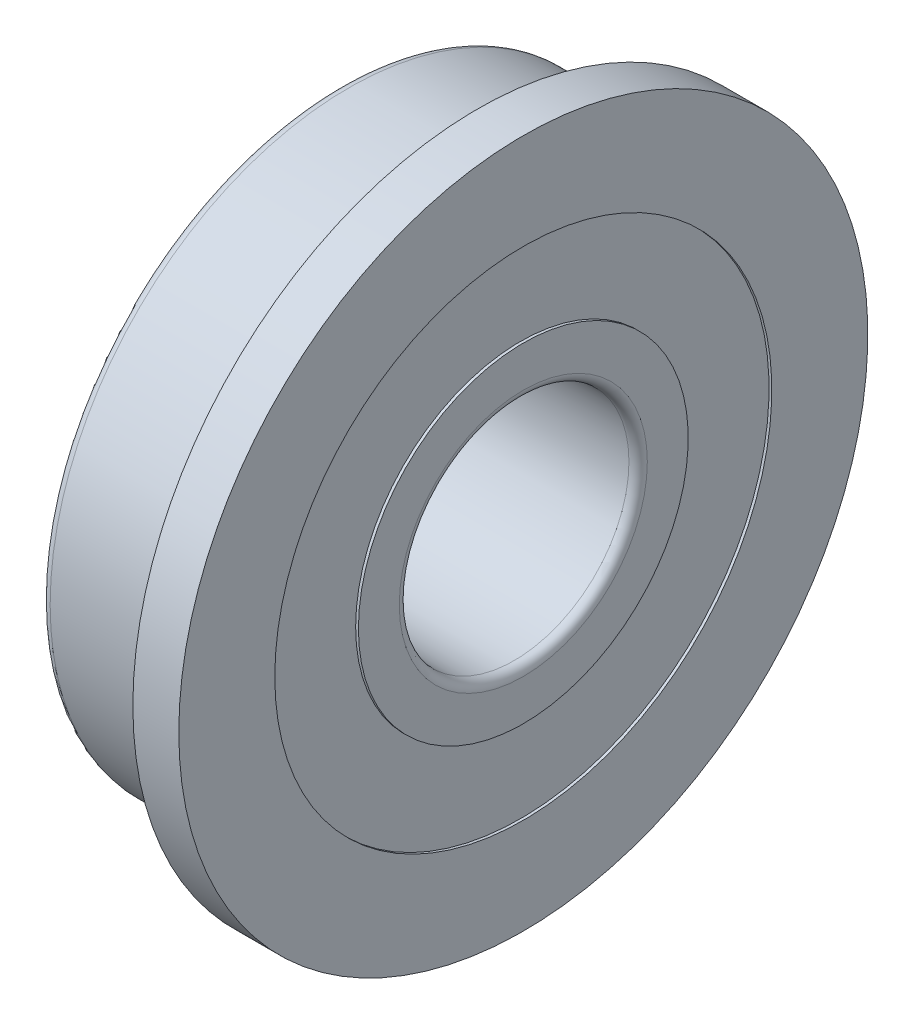
ISO-10303-21;
HEADER;
FILE_DESCRIPTION(('STEP AP214'),'2;1');
FILE_NAME('part.step','',(''),(''),'','','');
FILE_SCHEMA(('AUTOMOTIVE_DESIGN { 1 0 10303 214 1 1 1 1 }'));
ENDSEC;
DATA;
#1=APPLICATION_CONTEXT('core data for automotive mechanical design processes');
#2=APPLICATION_PROTOCOL_DEFINITION('international standard','automotive_design',2000,#1);
#3=PRODUCT_CONTEXT('',#1,'mechanical');
#4=PRODUCT('Part','Part','',(#3));
#5=PRODUCT_RELATED_PRODUCT_CATEGORY('part','',(#4));
#6=PRODUCT_DEFINITION_FORMATION('','',#4);
#7=PRODUCT_DEFINITION_CONTEXT('part definition',#1,'design');
#8=PRODUCT_DEFINITION('design','',#6,#7);
#9=PRODUCT_DEFINITION_SHAPE('','',#8);
#10=(LENGTH_UNIT() NAMED_UNIT(*) SI_UNIT(.MILLI.,.METRE.));
#11=(NAMED_UNIT(*) PLANE_ANGLE_UNIT() SI_UNIT($,.RADIAN.));
#12=(NAMED_UNIT(*) SI_UNIT($,.STERADIAN.) SOLID_ANGLE_UNIT());
#13=UNCERTAINTY_MEASURE_WITH_UNIT(LENGTH_MEASURE(1.E-05),#10,'distance_accuracy_value','');
#14=(GEOMETRIC_REPRESENTATION_CONTEXT(3) GLOBAL_UNCERTAINTY_ASSIGNED_CONTEXT((#13)) GLOBAL_UNIT_ASSIGNED_CONTEXT((#10,
#11,#12)) REPRESENTATION_CONTEXT('',''));
#15=CARTESIAN_POINT('',(0.,0.,0.));
#16=DIRECTION('',(0.,0.,1.));
#17=DIRECTION('',(1.,0.,0.));
#18=AXIS2_PLACEMENT_3D('',#15,#16,#17);
#19=CARTESIAN_POINT('',(0.,0.,0.));
#20=DIRECTION('',(-1.,0.,0.));
#21=DIRECTION('',(0.,0.,1.));
#22=AXIS2_PLACEMENT_3D('',#19,#20,#21);
#23=CYLINDRICAL_SURFACE('',#22,3.59);
#24=CARTESIAN_POINT('',(0.3,0.,0.));
#25=DIRECTION('',(-1.,0.,0.));
#26=DIRECTION('',(0.,0.,1.));
#27=AXIS2_PLACEMENT_3D('',#24,#25,#26);
#28=CIRCLE('',#27,3.59);
#29=CARTESIAN_POINT('',(0.3,0.,3.59));
#30=VERTEX_POINT('',#29);
#31=EDGE_CURVE('E11',#30,#30,#28,.T.);
#32=ORIENTED_EDGE('',*,*,#31,.F.);
#33=EDGE_LOOP('',(#32));
#34=FACE_BOUND('',#33,.T.);
#35=CARTESIAN_POINT('',(0.0600000000000002,0.,0.));
#36=DIRECTION('',(-1.,0.,0.));
#37=DIRECTION('',(0.,0.,1.));
#38=AXIS2_PLACEMENT_3D('',#35,#36,#37);
#39=CIRCLE('',#38,3.59);
#40=CARTESIAN_POINT('',(0.0600000000000002,0.,3.59));
#41=VERTEX_POINT('',#40);
#42=EDGE_CURVE('E53',#41,#41,#39,.T.);
#43=ORIENTED_EDGE('',*,*,#42,.T.);
#44=EDGE_LOOP('',(#43));
#45=FACE_BOUND('',#44,.T.);
#46=ADVANCED_FACE('F39',(#34,#45),#23,.F.);
#47=CARTESIAN_POINT('',(0.3,3.59,0.));
#48=DIRECTION('',(-1.,0.,0.));
#49=DIRECTION('',(0.,0.,1.));
#50=AXIS2_PLACEMENT_3D('',#47,#48,#49);
#51=PLANE('',#50);
#52=CARTESIAN_POINT('',(0.3,0.,0.));
#53=DIRECTION('',(-1.,0.,0.));
#54=DIRECTION('',(0.,0.,1.));
#55=AXIS2_PLACEMENT_3D('',#52,#53,#54);
#56=CIRCLE('',#55,5.41);
#57=CARTESIAN_POINT('',(0.3,0.,5.41));
#58=VERTEX_POINT('',#57);
#59=EDGE_CURVE('E45',#58,#58,#56,.T.);
#60=ORIENTED_EDGE('',*,*,#59,.F.);
#61=EDGE_LOOP('',(#60));
#62=FACE_BOUND('',#61,.T.);
#63=ORIENTED_EDGE('',*,*,#31,.T.);
#64=EDGE_LOOP('',(#63));
#65=FACE_BOUND('',#64,.T.);
#66=ADVANCED_FACE('F68',(#62,#65),#51,.F.);
#67=CARTESIAN_POINT('',(0.,0.,0.));
#68=DIRECTION('',(-1.,0.,0.));
#69=DIRECTION('',(0.,0.,1.));
#70=AXIS2_PLACEMENT_3D('',#67,#68,#69);
#71=CYLINDRICAL_SURFACE('',#70,5.41);
#72=CARTESIAN_POINT('',(0.0600000000000002,0.,0.));
#73=DIRECTION('',(-1.,0.,0.));
#74=DIRECTION('',(0.,0.,1.));
#75=AXIS2_PLACEMENT_3D('',#72,#73,#74);
#76=CIRCLE('',#75,5.41);
#77=CARTESIAN_POINT('',(0.0600000000000002,0.,5.41));
#78=VERTEX_POINT('',#77);
#79=EDGE_CURVE('E49',#78,#78,#76,.T.);
#80=ORIENTED_EDGE('',*,*,#79,.F.);
#81=EDGE_LOOP('',(#80));
#82=FACE_BOUND('',#81,.T.);
#83=ORIENTED_EDGE('',*,*,#59,.T.);
#84=EDGE_LOOP('',(#83));
#85=FACE_BOUND('',#84,.T.);
#86=ADVANCED_FACE('F63',(#82,#85),#71,.T.);
#87=CARTESIAN_POINT('',(0.0600000000000002,5.41,0.));
#88=DIRECTION('',(1.,0.,0.));
#89=DIRECTION('',(0.,0.,-1.));
#90=AXIS2_PLACEMENT_3D('',#87,#88,#89);
#91=PLANE('',#90);
#92=ORIENTED_EDGE('',*,*,#42,.F.);
#93=EDGE_LOOP('',(#92));
#94=FACE_BOUND('',#93,.T.);
#95=ORIENTED_EDGE('',*,*,#79,.T.);
#96=EDGE_LOOP('',(#95));
#97=FACE_BOUND('',#96,.T.);
#98=ADVANCED_FACE('F60',(#94,#97),#91,.F.);
#99=CLOSED_SHELL('',(#46,#66,#86,#98));
#100=MANIFOLD_SOLID_BREP('B2',#99);
#101=CARTESIAN_POINT('',(3.7,3.59,0.));
#102=DIRECTION('',(1.,0.,0.));
#103=DIRECTION('',(0.,0.,-1.));
#104=AXIS2_PLACEMENT_3D('',#101,#102,#103);
#105=PLANE('',#104);
#106=CARTESIAN_POINT('',(3.7,0.,0.));
#107=DIRECTION('',(-1.,0.,0.));
#108=DIRECTION('',(0.,0.,1.));
#109=AXIS2_PLACEMENT_3D('',#106,#107,#108);
#110=CIRCLE('',#109,3.59);
#111=CARTESIAN_POINT('',(3.7,0.,3.59));
#112=VERTEX_POINT('',#111);
#113=EDGE_CURVE('E120',#112,#112,#110,.T.);
#114=ORIENTED_EDGE('',*,*,#113,.F.);
#115=EDGE_LOOP('',(#114));
#116=FACE_BOUND('',#115,.T.);
#117=CARTESIAN_POINT('',(3.7,0.,0.));
#118=DIRECTION('',(-1.,0.,0.));
#119=DIRECTION('',(0.,0.,1.));
#120=AXIS2_PLACEMENT_3D('',#117,#118,#119);
#121=CIRCLE('',#120,5.41);
#122=CARTESIAN_POINT('',(3.7,0.,5.41));
#123=VERTEX_POINT('',#122);
#124=EDGE_CURVE('E38',#123,#123,#121,.T.);
#125=ORIENTED_EDGE('',*,*,#124,.T.);
#126=EDGE_LOOP('',(#125));
#127=FACE_BOUND('',#126,.T.);
#128=ADVANCED_FACE('F106',(#116,#127),#105,.F.);
#129=CARTESIAN_POINT('',(0.,0.,0.));
#130=DIRECTION('',(-1.,0.,0.));
#131=DIRECTION('',(0.,0.,1.));
#132=AXIS2_PLACEMENT_3D('',#129,#130,#131);
#133=CYLINDRICAL_SURFACE('',#132,5.41);
#134=ORIENTED_EDGE('',*,*,#124,.F.);
#135=EDGE_LOOP('',(#134));
#136=FACE_BOUND('',#135,.T.);
#137=CARTESIAN_POINT('',(3.94,0.,0.));
#138=DIRECTION('',(-1.,0.,0.));
#139=DIRECTION('',(0.,0.,1.));
#140=AXIS2_PLACEMENT_3D('',#137,#138,#139);
#141=CIRCLE('',#140,5.41);
#142=CARTESIAN_POINT('',(3.94,0.,5.41));
#143=VERTEX_POINT('',#142);
#144=EDGE_CURVE('E112',#143,#143,#141,.T.);
#145=ORIENTED_EDGE('',*,*,#144,.T.);
#146=EDGE_LOOP('',(#145));
#147=FACE_BOUND('',#146,.T.);
#148=ADVANCED_FACE('F129',(#136,#147),#133,.T.);
#149=CARTESIAN_POINT('',(3.94,5.41,0.));
#150=DIRECTION('',(-1.,0.,0.));
#151=DIRECTION('',(0.,0.,1.));
#152=AXIS2_PLACEMENT_3D('',#149,#150,#151);
#153=PLANE('',#152);
#154=ORIENTED_EDGE('',*,*,#144,.F.);
#155=EDGE_LOOP('',(#154));
#156=FACE_BOUND('',#155,.T.);
#157=CARTESIAN_POINT('',(3.94,0.,0.));
#158=DIRECTION('',(-1.,0.,0.));
#159=DIRECTION('',(0.,0.,1.));
#160=AXIS2_PLACEMENT_3D('',#157,#158,#159);
#161=CIRCLE('',#160,3.59);
#162=CARTESIAN_POINT('',(3.94,0.,3.59));
#163=VERTEX_POINT('',#162);
#164=EDGE_CURVE('E116',#163,#163,#161,.T.);
#165=ORIENTED_EDGE('',*,*,#164,.T.);
#166=EDGE_LOOP('',(#165));
#167=FACE_BOUND('',#166,.T.);
#168=ADVANCED_FACE('F133',(#156,#167),#153,.F.);
#169=CARTESIAN_POINT('',(0.,0.,0.));
#170=DIRECTION('',(-1.,0.,0.));
#171=DIRECTION('',(0.,0.,1.));
#172=AXIS2_PLACEMENT_3D('',#169,#170,#171);
#173=CYLINDRICAL_SURFACE('',#172,3.59);
#174=ORIENTED_EDGE('',*,*,#164,.F.);
#175=EDGE_LOOP('',(#174));
#176=FACE_BOUND('',#175,.T.);
#177=ORIENTED_EDGE('',*,*,#113,.T.);
#178=EDGE_LOOP('',(#177));
#179=FACE_BOUND('',#178,.T.);
#180=ADVANCED_FACE('F126',(#176,#179),#173,.F.);
#181=CLOSED_SHELL('',(#128,#148,#168,#180));
#182=MANIFOLD_SOLID_BREP('B6',#181);
#183=CARTESIAN_POINT('',(2.,3.78564089774035,2.43288367855014));
#184=DIRECTION('',(-1.,0.,0.));
#185=DIRECTION('',(0.,0.841253532831188,0.540640817455586));
#186=AXIS2_PLACEMENT_3D('',#183,#184,#185);
#187=SPHERICAL_SURFACE('',#186,1.);
#188=CARTESIAN_POINT('',(1.,3.78564089774035,2.43288367855014));
#189=VERTEX_POINT('',#188);
#190=VERTEX_LOOP('',#189);
#191=FACE_BOUND('',#190,.T.);
#192=ADVANCED_FACE('F173',(#191),#187,.T.);
#193=CLOSED_SHELL('',(#192));
#194=MANIFOLD_SOLID_BREP('B33',#193);
#195=CARTESIAN_POINT('',(2.,1.86936755850854,4.09334397909531));
#196=DIRECTION('',(-1.,0.,0.));
#197=DIRECTION('',(0.,0.415415013001897,0.909631995354513));
#198=AXIS2_PLACEMENT_3D('',#195,#196,#197);
#199=SPHERICAL_SURFACE('',#198,1.);
#200=CARTESIAN_POINT('',(1.,1.86936755850854,4.09334397909531));
#201=VERTEX_POINT('',#200);
#202=VERTEX_LOOP('',#201);
#203=FACE_BOUND('',#202,.T.);
#204=ADVANCED_FACE('F191',(#203),#199,.T.);
#205=CLOSED_SHELL('',(#204));
#206=MANIFOLD_SOLID_BREP('B102',#205);
#207=CARTESIAN_POINT('',(2.,-0.640416772229736,4.4541964884642));
#208=DIRECTION('',(-1.,0.,0.));
#209=DIRECTION('',(0.,-0.142314838273275,0.989821441880934));
#210=AXIS2_PLACEMENT_3D('',#207,#208,#209);
#211=SPHERICAL_SURFACE('',#210,1.);
#212=CARTESIAN_POINT('',(1.,-0.640416772229736,4.4541964884642));
#213=VERTEX_POINT('',#212);
#214=VERTEX_LOOP('',#213);
#215=FACE_BOUND('',#214,.T.);
#216=ADVANCED_FACE('F209',(#215),#211,.T.);
#217=CLOSED_SHELL('',(#216));
#218=MANIFOLD_SOLID_BREP('B169',#217);
#219=CARTESIAN_POINT('',(2.,-2.94687330275375,3.40087308459419));
#220=DIRECTION('',(-1.,0.,0.));
#221=DIRECTION('',(0.,-0.654860733945278,0.755749574354264));
#222=AXIS2_PLACEMENT_3D('',#219,#220,#221);
#223=SPHERICAL_SURFACE('',#222,1.);
#224=CARTESIAN_POINT('',(1.,-2.94687330275375,3.40087308459419));
#225=VERTEX_POINT('',#224);
#226=VERTEX_LOOP('',#225);
#227=FACE_BOUND('',#226,.T.);
#228=ADVANCED_FACE('F227',(#227),#223,.T.);
#229=CLOSED_SHELL('',(#228));
#230=MANIFOLD_SOLID_BREP('B187',#229);
#231=CARTESIAN_POINT('',(2.,-4.31771838126523,1.26779650578647));
#232=DIRECTION('',(-1.,0.,0.));
#233=DIRECTION('',(0.,-0.959492973614495,0.281732556841437));
#234=AXIS2_PLACEMENT_3D('',#231,#232,#233);
#235=SPHERICAL_SURFACE('',#234,1.);
#236=CARTESIAN_POINT('',(1.,-4.31771838126523,1.26779650578647));
#237=VERTEX_POINT('',#236);
#238=VERTEX_LOOP('',#237);
#239=FACE_BOUND('',#238,.T.);
#240=ADVANCED_FACE('F245',(#239),#235,.T.);
#241=CLOSED_SHELL('',(#240));
#242=MANIFOLD_SOLID_BREP('B205',#241);
#243=CARTESIAN_POINT('',(2.,-4.31771838126525,-1.2677965057864));
#244=DIRECTION('',(-1.,0.,0.));
#245=DIRECTION('',(0.,-0.959492973614499,-0.281732556841423));
#246=AXIS2_PLACEMENT_3D('',#243,#244,#245);
#247=SPHERICAL_SURFACE('',#246,1.);
#248=CARTESIAN_POINT('',(1.,-4.31771838126525,-1.2677965057864));
#249=VERTEX_POINT('',#248);
#250=VERTEX_LOOP('',#249);
#251=FACE_BOUND('',#250,.T.);
#252=ADVANCED_FACE('F263',(#251),#247,.T.);
#253=CLOSED_SHELL('',(#252));
#254=MANIFOLD_SOLID_BREP('B223',#253);
#255=CARTESIAN_POINT('',(2.,-2.9468733027538,-3.40087308459415));
#256=DIRECTION('',(-1.,0.,0.));
#257=DIRECTION('',(0.,-0.654860733945289,-0.755749574354255));
#258=AXIS2_PLACEMENT_3D('',#255,#256,#257);
#259=SPHERICAL_SURFACE('',#258,1.);
#260=CARTESIAN_POINT('',(1.,-2.9468733027538,-3.40087308459415));
#261=VERTEX_POINT('',#260);
#262=VERTEX_LOOP('',#261);
#263=FACE_BOUND('',#262,.T.);
#264=ADVANCED_FACE('F281',(#263),#259,.T.);
#265=CLOSED_SHELL('',(#264));
#266=MANIFOLD_SOLID_BREP('B241',#265);
#267=CARTESIAN_POINT('',(2.,-0.6404167722298,-4.45419648846419));
#268=DIRECTION('',(-1.,0.,0.));
#269=DIRECTION('',(0.,-0.142314838273289,-0.989821441880932));
#270=AXIS2_PLACEMENT_3D('',#267,#268,#269);
#271=SPHERICAL_SURFACE('',#270,1.);
#272=CARTESIAN_POINT('',(1.,-0.6404167722298,-4.45419648846419));
#273=VERTEX_POINT('',#272);
#274=VERTEX_LOOP('',#273);
#275=FACE_BOUND('',#274,.T.);
#276=ADVANCED_FACE('F299',(#275),#271,.T.);
#277=CLOSED_SHELL('',(#276));
#278=MANIFOLD_SOLID_BREP('B259',#277);
#279=CARTESIAN_POINT('',(2.,1.86936755850848,-4.09334397909534));
#280=DIRECTION('',(-1.,0.,0.));
#281=DIRECTION('',(0.,0.415415013001884,-0.909631995354519));
#282=AXIS2_PLACEMENT_3D('',#279,#280,#281);
#283=SPHERICAL_SURFACE('',#282,1.);
#284=CARTESIAN_POINT('',(1.,1.86936755850848,-4.09334397909534));
#285=VERTEX_POINT('',#284);
#286=VERTEX_LOOP('',#285);
#287=FACE_BOUND('',#286,.T.);
#288=ADVANCED_FACE('F317',(#287),#283,.T.);
#289=CLOSED_SHELL('',(#288));
#290=MANIFOLD_SOLID_BREP('B277',#289);
#291=CARTESIAN_POINT('',(2.,3.78564089774031,-2.43288367855019));
#292=DIRECTION('',(-1.,0.,0.));
#293=DIRECTION('',(0.,0.841253532831181,-0.540640817455599));
#294=AXIS2_PLACEMENT_3D('',#291,#292,#293);
#295=SPHERICAL_SURFACE('',#294,1.);
#296=CARTESIAN_POINT('',(1.,3.78564089774031,-2.43288367855019));
#297=VERTEX_POINT('',#296);
#298=VERTEX_LOOP('',#297);
#299=FACE_BOUND('',#298,.T.);
#300=ADVANCED_FACE('F335',(#299),#295,.T.);
#301=CLOSED_SHELL('',(#300));
#302=MANIFOLD_SOLID_BREP('B295',#301);
#303=CARTESIAN_POINT('',(2.,4.5,0.));
#304=DIRECTION('',(-1.,0.,0.));
#305=DIRECTION('',(0.,1.,0.));
#306=AXIS2_PLACEMENT_3D('',#303,#304,#305);
#307=SPHERICAL_SURFACE('',#306,1.);
#308=CARTESIAN_POINT('',(1.,4.5,0.));
#309=VERTEX_POINT('',#308);
#310=VERTEX_LOOP('',#309);
#311=FACE_BOUND('',#310,.T.);
#312=ADVANCED_FACE('F355',(#311),#307,.T.);
#313=CLOSED_SHELL('',(#312));
#314=MANIFOLD_SOLID_BREP('B313',#313);
#315=CARTESIAN_POINT('',(0.,0.,0.));
#316=DIRECTION('',(1.,0.,0.));
#317=DIRECTION('',(0.,0.,-1.));
#318=AXIS2_PLACEMENT_3D('',#315,#316,#317);
#319=CYLINDRICAL_SURFACE('',#318,3.8);
#320=CARTESIAN_POINT('',(1.28585715714571,0.,0.));
#321=DIRECTION('',(1.,0.,0.));
#322=DIRECTION('',(0.,0.,-1.));
#323=AXIS2_PLACEMENT_3D('',#320,#321,#322);
#324=CIRCLE('',#323,3.8);
#325=CARTESIAN_POINT('',(1.28585715714571,0.,-3.8));
#326=VERTEX_POINT('',#325);
#327=EDGE_CURVE('E391',#326,#326,#324,.T.);
#328=ORIENTED_EDGE('',*,*,#327,.F.);
#329=EDGE_LOOP('',(#328));
#330=FACE_BOUND('',#329,.T.);
#331=CARTESIAN_POINT('',(0.3,0.,0.));
#332=DIRECTION('',(-1.,0.,0.));
#333=DIRECTION('',(0.,0.,1.));
#334=AXIS2_PLACEMENT_3D('',#331,#332,#333);
#335=CIRCLE('',#334,3.8);
#336=CARTESIAN_POINT('',(0.3,0.,3.8));
#337=VERTEX_POINT('',#336);
#338=EDGE_CURVE('E378',#337,#337,#335,.T.);
#339=ORIENTED_EDGE('',*,*,#338,.F.);
#340=EDGE_LOOP('',(#339));
#341=FACE_BOUND('',#340,.T.);
#342=ADVANCED_FACE('F374',(#330,#341),#319,.T.);
#343=CARTESIAN_POINT('',(0.,6.3,0.));
#344=DIRECTION('',(1.,0.,0.));
#345=DIRECTION('',(0.,0.,-1.));
#346=AXIS2_PLACEMENT_3D('',#343,#344,#345);
#347=PLANE('',#346);
#348=CARTESIAN_POINT('',(0.,0.,0.));
#349=DIRECTION('',(-1.,0.,0.));
#350=DIRECTION('',(0.,0.,1.));
#351=AXIS2_PLACEMENT_3D('',#348,#349,#350);
#352=CIRCLE('',#351,2.7);
#353=CARTESIAN_POINT('',(0.,0.,2.7));
#354=VERTEX_POINT('',#353);
#355=EDGE_CURVE('E397',#354,#354,#352,.T.);
#356=ORIENTED_EDGE('',*,*,#355,.F.);
#357=EDGE_LOOP('',(#356));
#358=FACE_BOUND('',#357,.T.);
#359=CARTESIAN_POINT('',(0.,0.,0.));
#360=DIRECTION('',(-1.,0.,0.));
#361=DIRECTION('',(0.,0.,1.));
#362=AXIS2_PLACEMENT_3D('',#359,#360,#361);
#363=CIRCLE('',#362,3.59);
#364=CARTESIAN_POINT('',(0.,0.,3.59));
#365=VERTEX_POINT('',#364);
#366=EDGE_CURVE('E430',#365,#365,#363,.T.);
#367=ORIENTED_EDGE('',*,*,#366,.T.);
#368=EDGE_LOOP('',(#367));
#369=FACE_BOUND('',#368,.T.);
#370=ADVANCED_FACE('F424',(#358,#369),#347,.F.);
#371=CARTESIAN_POINT('',(0.,0.,0.));
#372=DIRECTION('',(1.,0.,0.));
#373=DIRECTION('',(0.,0.,-1.));
#374=AXIS2_PLACEMENT_3D('',#371,#372,#373);
#375=CYLINDRICAL_SURFACE('',#374,3.8);
#376=CARTESIAN_POINT('',(2.71414284285429,0.,0.));
#377=DIRECTION('',(1.,0.,0.));
#378=DIRECTION('',(0.,0.,-1.));
#379=AXIS2_PLACEMENT_3D('',#376,#377,#378);
#380=CIRCLE('',#379,3.8);
#381=CARTESIAN_POINT('',(2.71414284285429,0.,-3.8));
#382=VERTEX_POINT('',#381);
#383=EDGE_CURVE('E394',#382,#382,#380,.T.);
#384=ORIENTED_EDGE('',*,*,#383,.T.);
#385=EDGE_LOOP('',(#384));
#386=FACE_BOUND('',#385,.T.);
#387=CARTESIAN_POINT('',(3.7,0.,0.));
#388=DIRECTION('',(1.,0.,0.));
#389=DIRECTION('',(0.,0.,-1.));
#390=AXIS2_PLACEMENT_3D('',#387,#388,#389);
#391=CIRCLE('',#390,3.8);
#392=CARTESIAN_POINT('',(3.7,0.,-3.8));
#393=VERTEX_POINT('',#392);
#394=EDGE_CURVE('E395',#393,#393,#391,.T.);
#395=ORIENTED_EDGE('',*,*,#394,.F.);
#396=EDGE_LOOP('',(#395));
#397=FACE_BOUND('',#396,.T.);
#398=ADVANCED_FACE('F427',(#386,#397),#375,.T.);
#399=CARTESIAN_POINT('',(4.,7.5,0.));
#400=DIRECTION('',(-1.,0.,0.));
#401=DIRECTION('',(0.,0.,1.));
#402=AXIS2_PLACEMENT_3D('',#399,#400,#401);
#403=PLANE('',#402);
#404=CARTESIAN_POINT('',(4.,0.,0.));
#405=DIRECTION('',(-1.,0.,0.));
#406=DIRECTION('',(0.,0.,1.));
#407=AXIS2_PLACEMENT_3D('',#404,#405,#406);
#408=CIRCLE('',#407,2.7);
#409=CARTESIAN_POINT('',(4.,0.,2.7));
#410=VERTEX_POINT('',#409);
#411=EDGE_CURVE('E354',#410,#410,#408,.T.);
#412=ORIENTED_EDGE('',*,*,#411,.T.);
#413=EDGE_LOOP('',(#412));
#414=FACE_BOUND('',#413,.T.);
#415=CARTESIAN_POINT('',(4.,0.,0.));
#416=DIRECTION('',(-1.,0.,0.));
#417=DIRECTION('',(0.,0.,1.));
#418=AXIS2_PLACEMENT_3D('',#415,#416,#417);
#419=CIRCLE('',#418,3.59);
#420=CARTESIAN_POINT('',(4.,0.,3.59));
#421=VERTEX_POINT('',#420);
#422=EDGE_CURVE('E403',#421,#421,#419,.T.);
#423=ORIENTED_EDGE('',*,*,#422,.F.);
#424=EDGE_LOOP('',(#423));
#425=FACE_BOUND('',#424,.T.);
#426=ADVANCED_FACE('F376',(#414,#425),#403,.F.);
#427=CARTESIAN_POINT('',(2.,0.,0.));
#428=DIRECTION('',(1.,0.,0.));
#429=DIRECTION('',(0.,0.,-1.));
#430=AXIS2_PLACEMENT_3D('',#427,#428,#429);
#431=TOROIDAL_SURFACE('',#430,4.5,1.);
#432=ORIENTED_EDGE('',*,*,#383,.F.);
#433=EDGE_LOOP('',(#432));
#434=FACE_BOUND('',#433,.T.);
#435=ORIENTED_EDGE('',*,*,#327,.T.);
#436=EDGE_LOOP('',(#435));
#437=FACE_BOUND('',#436,.T.);
#438=ADVANCED_FACE('F420',(#434,#437),#431,.F.);
#439=CARTESIAN_POINT('',(0.200000000000001,0.,0.));
#440=DIRECTION('',(-1.,0.,0.));
#441=DIRECTION('',(0.,0.,1.));
#442=AXIS2_PLACEMENT_3D('',#439,#440,#441);
#443=TOROIDAL_SURFACE('',#442,2.7,0.2);
#444=CARTESIAN_POINT('',(0.200000000000001,0.,0.));
#445=DIRECTION('',(-1.,0.,0.));
#446=DIRECTION('',(0.,0.,1.));
#447=AXIS2_PLACEMENT_3D('',#444,#445,#446);
#448=CIRCLE('',#447,2.5);
#449=CARTESIAN_POINT('',(0.200000000000001,0.,2.5));
#450=VERTEX_POINT('',#449);
#451=EDGE_CURVE('E387',#450,#450,#448,.T.);
#452=ORIENTED_EDGE('',*,*,#451,.F.);
#453=EDGE_LOOP('',(#452));
#454=FACE_BOUND('',#453,.T.);
#455=ORIENTED_EDGE('',*,*,#355,.T.);
#456=EDGE_LOOP('',(#455));
#457=FACE_BOUND('',#456,.T.);
#458=ADVANCED_FACE('F417',(#454,#457),#443,.T.);
#459=CARTESIAN_POINT('',(0.,0.,0.));
#460=DIRECTION('',(-1.,0.,0.));
#461=DIRECTION('',(0.,0.,1.));
#462=AXIS2_PLACEMENT_3D('',#459,#460,#461);
#463=CYLINDRICAL_SURFACE('',#462,2.5);
#464=CARTESIAN_POINT('',(3.8,0.,0.));
#465=DIRECTION('',(-1.,0.,0.));
#466=DIRECTION('',(0.,0.,1.));
#467=AXIS2_PLACEMENT_3D('',#464,#465,#466);
#468=CIRCLE('',#467,2.5);
#469=CARTESIAN_POINT('',(3.8,0.,2.5));
#470=VERTEX_POINT('',#469);
#471=EDGE_CURVE('E382',#470,#470,#468,.T.);
#472=ORIENTED_EDGE('',*,*,#471,.F.);
#473=EDGE_LOOP('',(#472));
#474=FACE_BOUND('',#473,.T.);
#475=ORIENTED_EDGE('',*,*,#451,.T.);
#476=EDGE_LOOP('',(#475));
#477=FACE_BOUND('',#476,.T.);
#478=ADVANCED_FACE('F415',(#474,#477),#463,.F.);
#479=CARTESIAN_POINT('',(3.8,0.,0.));
#480=DIRECTION('',(-1.,0.,0.));
#481=DIRECTION('',(0.,0.,1.));
#482=AXIS2_PLACEMENT_3D('',#479,#480,#481);
#483=TOROIDAL_SURFACE('',#482,2.7,0.200000000000001);
#484=ORIENTED_EDGE('',*,*,#411,.F.);
#485=EDGE_LOOP('',(#484));
#486=FACE_BOUND('',#485,.T.);
#487=ORIENTED_EDGE('',*,*,#471,.T.);
#488=EDGE_LOOP('',(#487));
#489=FACE_BOUND('',#488,.T.);
#490=ADVANCED_FACE('F450',(#486,#489),#483,.T.);
#491=CARTESIAN_POINT('',(3.7,5.41,0.));
#492=DIRECTION('',(1.,0.,0.));
#493=DIRECTION('',(0.,0.,-1.));
#494=AXIS2_PLACEMENT_3D('',#491,#492,#493);
#495=PLANE('',#494);
#496=CARTESIAN_POINT('',(3.7,0.,0.));
#497=DIRECTION('',(-1.,0.,0.));
#498=DIRECTION('',(0.,0.,1.));
#499=AXIS2_PLACEMENT_3D('',#496,#497,#498);
#500=CIRCLE('',#499,3.59);
#501=CARTESIAN_POINT('',(3.7,0.,3.59));
#502=VERTEX_POINT('',#501);
#503=EDGE_CURVE('E399',#502,#502,#500,.T.);
#504=ORIENTED_EDGE('',*,*,#503,.T.);
#505=EDGE_LOOP('',(#504));
#506=FACE_BOUND('',#505,.T.);
#507=ORIENTED_EDGE('',*,*,#394,.T.);
#508=EDGE_LOOP('',(#507));
#509=FACE_BOUND('',#508,.T.);
#510=ADVANCED_FACE('F471',(#506,#509),#495,.T.);
#511=CARTESIAN_POINT('',(0.,0.,0.));
#512=DIRECTION('',(-1.,0.,0.));
#513=DIRECTION('',(0.,0.,1.));
#514=AXIS2_PLACEMENT_3D('',#511,#512,#513);
#515=CYLINDRICAL_SURFACE('',#514,3.59);
#516=ORIENTED_EDGE('',*,*,#422,.T.);
#517=EDGE_LOOP('',(#516));
#518=FACE_BOUND('',#517,.T.);
#519=ORIENTED_EDGE('',*,*,#503,.F.);
#520=EDGE_LOOP('',(#519));
#521=FACE_BOUND('',#520,.T.);
#522=ADVANCED_FACE('F468',(#518,#521),#515,.T.);
#523=CARTESIAN_POINT('',(0.3,5.41,0.));
#524=DIRECTION('',(-1.,0.,0.));
#525=DIRECTION('',(0.,0.,1.));
#526=AXIS2_PLACEMENT_3D('',#523,#524,#525);
#527=PLANE('',#526);
#528=CARTESIAN_POINT('',(0.3,0.,0.));
#529=DIRECTION('',(-1.,0.,0.));
#530=DIRECTION('',(0.,0.,1.));
#531=AXIS2_PLACEMENT_3D('',#528,#529,#530);
#532=CIRCLE('',#531,3.59);
#533=CARTESIAN_POINT('',(0.3,0.,3.59));
#534=VERTEX_POINT('',#533);
#535=EDGE_CURVE('E432',#534,#534,#532,.T.);
#536=ORIENTED_EDGE('',*,*,#535,.F.);
#537=EDGE_LOOP('',(#536));
#538=FACE_BOUND('',#537,.T.);
#539=ORIENTED_EDGE('',*,*,#338,.T.);
#540=EDGE_LOOP('',(#539));
#541=FACE_BOUND('',#540,.T.);
#542=ADVANCED_FACE('F440',(#538,#541),#527,.T.);
#543=CARTESIAN_POINT('',(0.,0.,0.));
#544=DIRECTION('',(-1.,0.,0.));
#545=DIRECTION('',(0.,0.,1.));
#546=AXIS2_PLACEMENT_3D('',#543,#544,#545);
#547=CYLINDRICAL_SURFACE('',#546,3.59);
#548=ORIENTED_EDGE('',*,*,#535,.T.);
#549=EDGE_LOOP('',(#548));
#550=FACE_BOUND('',#549,.T.);
#551=ORIENTED_EDGE('',*,*,#366,.F.);
#552=EDGE_LOOP('',(#551));
#553=FACE_BOUND('',#552,.T.);
#554=ADVANCED_FACE('F477',(#550,#553),#547,.T.);
#555=CLOSED_SHELL('',(#342,#370,#398,#426,#438,#458,#478,#490,#510,#522,#542,#554));
#556=MANIFOLD_SOLID_BREP('B331',#555);
#557=CARTESIAN_POINT('',(0.,6.3,0.));
#558=DIRECTION('',(1.,0.,0.));
#559=DIRECTION('',(0.,0.,-1.));
#560=AXIS2_PLACEMENT_3D('',#557,#558,#559);
#561=PLANE('',#560);
#562=CARTESIAN_POINT('',(0.,0.,0.));
#563=DIRECTION('',(-1.,0.,0.));
#564=DIRECTION('',(0.,0.,1.));
#565=AXIS2_PLACEMENT_3D('',#562,#563,#564);
#566=CIRCLE('',#565,6.3);
#567=CARTESIAN_POINT('',(0.,0.,6.3));
#568=VERTEX_POINT('',#567);
#569=EDGE_CURVE('E373',#568,#568,#566,.T.);
#570=ORIENTED_EDGE('',*,*,#569,.T.);
#571=EDGE_LOOP('',(#570));
#572=FACE_BOUND('',#571,.T.);
#573=CARTESIAN_POINT('',(0.,0.,0.));
#574=DIRECTION('',(-1.,0.,0.));
#575=DIRECTION('',(0.,0.,1.));
#576=AXIS2_PLACEMENT_3D('',#573,#574,#575);
#577=CIRCLE('',#576,5.41);
#578=CARTESIAN_POINT('',(0.,0.,5.41));
#579=VERTEX_POINT('',#578);
#580=EDGE_CURVE('E713',#579,#579,#577,.T.);
#581=ORIENTED_EDGE('',*,*,#580,.F.);
#582=EDGE_LOOP('',(#581));
#583=FACE_BOUND('',#582,.T.);
#584=ADVANCED_FACE('F555',(#572,#583),#561,.F.);
#585=CARTESIAN_POINT('',(0.,0.,0.));
#586=DIRECTION('',(1.,0.,0.));
#587=DIRECTION('',(0.,0.,-1.));
#588=AXIS2_PLACEMENT_3D('',#585,#586,#587);
#589=CYLINDRICAL_SURFACE('',#588,5.2);
#590=CARTESIAN_POINT('',(1.28585715714572,0.,0.));
#591=DIRECTION('',(1.,0.,0.));
#592=DIRECTION('',(0.,0.,-1.));
#593=AXIS2_PLACEMENT_3D('',#590,#591,#592);
#594=CIRCLE('',#593,5.2);
#595=CARTESIAN_POINT('',(1.28585715714572,0.,-5.2));
#596=VERTEX_POINT('',#595);
#597=EDGE_CURVE('E578',#596,#596,#594,.T.);
#598=ORIENTED_EDGE('',*,*,#597,.T.);
#599=EDGE_LOOP('',(#598));
#600=FACE_BOUND('',#599,.T.);
#601=CARTESIAN_POINT('',(0.3,0.,0.));
#602=DIRECTION('',(-1.,0.,0.));
#603=DIRECTION('',(0.,0.,1.));
#604=AXIS2_PLACEMENT_3D('',#601,#602,#603);
#605=CIRCLE('',#604,5.2);
#606=CARTESIAN_POINT('',(0.3,0.,5.2));
#607=VERTEX_POINT('',#606);
#608=EDGE_CURVE('E559',#607,#607,#605,.F.);
#609=ORIENTED_EDGE('',*,*,#608,.F.);
#610=EDGE_LOOP('',(#609));
#611=FACE_BOUND('',#610,.T.);
#612=ADVANCED_FACE('F611',(#600,#611),#589,.F.);
#613=CARTESIAN_POINT('',(4.,7.5,0.));
#614=DIRECTION('',(-1.,0.,0.));
#615=DIRECTION('',(0.,0.,1.));
#616=AXIS2_PLACEMENT_3D('',#613,#614,#615);
#617=PLANE('',#616);
#618=CARTESIAN_POINT('',(4.,0.,0.));
#619=DIRECTION('',(-1.,0.,0.));
#620=DIRECTION('',(0.,0.,1.));
#621=AXIS2_PLACEMENT_3D('',#618,#619,#620);
#622=CIRCLE('',#621,7.5);
#623=CARTESIAN_POINT('',(4.,0.,7.5));
#624=VERTEX_POINT('',#623);
#625=EDGE_CURVE('E563',#624,#624,#622,.T.);
#626=ORIENTED_EDGE('',*,*,#625,.F.);
#627=EDGE_LOOP('',(#626));
#628=FACE_BOUND('',#627,.T.);
#629=CARTESIAN_POINT('',(4.,0.,0.));
#630=DIRECTION('',(-1.,0.,0.));
#631=DIRECTION('',(0.,0.,1.));
#632=AXIS2_PLACEMENT_3D('',#629,#630,#631);
#633=CIRCLE('',#632,5.41);
#634=CARTESIAN_POINT('',(4.,0.,5.41));
#635=VERTEX_POINT('',#634);
#636=EDGE_CURVE('E581',#635,#635,#633,.T.);
#637=ORIENTED_EDGE('',*,*,#636,.T.);
#638=EDGE_LOOP('',(#637));
#639=FACE_BOUND('',#638,.T.);
#640=ADVANCED_FACE('F607',(#628,#639),#617,.F.);
#641=CARTESIAN_POINT('',(0.,0.,0.));
#642=DIRECTION('',(1.,0.,0.));
#643=DIRECTION('',(0.,0.,-1.));
#644=AXIS2_PLACEMENT_3D('',#641,#642,#643);
#645=CYLINDRICAL_SURFACE('',#644,5.2);
#646=CARTESIAN_POINT('',(2.71414284285428,0.,0.));
#647=DIRECTION('',(1.,0.,0.));
#648=DIRECTION('',(0.,0.,-1.));
#649=AXIS2_PLACEMENT_3D('',#646,#647,#648);
#650=CIRCLE('',#649,5.2);
#651=CARTESIAN_POINT('',(2.71414284285428,0.,-5.2));
#652=VERTEX_POINT('',#651);
#653=EDGE_CURVE('E573',#652,#652,#650,.T.);
#654=ORIENTED_EDGE('',*,*,#653,.F.);
#655=EDGE_LOOP('',(#654));
#656=FACE_BOUND('',#655,.T.);
#657=CARTESIAN_POINT('',(3.7,0.,0.));
#658=DIRECTION('',(1.,0.,0.));
#659=DIRECTION('',(0.,0.,-1.));
#660=AXIS2_PLACEMENT_3D('',#657,#658,#659);
#661=CIRCLE('',#660,5.2);
#662=CARTESIAN_POINT('',(3.7,0.,-5.2));
#663=VERTEX_POINT('',#662);
#664=EDGE_CURVE('E571',#663,#663,#661,.F.);
#665=ORIENTED_EDGE('',*,*,#664,.F.);
#666=EDGE_LOOP('',(#665));
#667=FACE_BOUND('',#666,.T.);
#668=ADVANCED_FACE('F610',(#656,#667),#645,.F.);
#669=CARTESIAN_POINT('',(0.200000000000001,0.,0.));
#670=DIRECTION('',(-1.,0.,0.));
#671=DIRECTION('',(0.,0.,1.));
#672=AXIS2_PLACEMENT_3D('',#669,#670,#671);
#673=TOROIDAL_SURFACE('',#672,6.3,0.2);
#674=ORIENTED_EDGE('',*,*,#569,.F.);
#675=EDGE_LOOP('',(#674));
#676=FACE_BOUND('',#675,.T.);
#677=CARTESIAN_POINT('',(0.200000000000001,0.,0.));
#678=DIRECTION('',(-1.,0.,0.));
#679=DIRECTION('',(0.,0.,1.));
#680=AXIS2_PLACEMENT_3D('',#677,#678,#679);
#681=CIRCLE('',#680,6.5);
#682=CARTESIAN_POINT('',(0.200000000000001,0.,6.5));
#683=VERTEX_POINT('',#682);
#684=EDGE_CURVE('E591',#683,#683,#681,.T.);
#685=ORIENTED_EDGE('',*,*,#684,.T.);
#686=EDGE_LOOP('',(#685));
#687=FACE_BOUND('',#686,.T.);
#688=ADVANCED_FACE('F557',(#676,#687),#673,.T.);
#689=CARTESIAN_POINT('',(0.,0.,0.));
#690=DIRECTION('',(-1.,0.,0.));
#691=DIRECTION('',(0.,0.,1.));
#692=AXIS2_PLACEMENT_3D('',#689,#690,#691);
#693=CYLINDRICAL_SURFACE('',#692,7.5);
#694=CARTESIAN_POINT('',(3.,0.,0.));
#695=DIRECTION('',(-1.,0.,0.));
#696=DIRECTION('',(0.,0.,1.));
#697=AXIS2_PLACEMENT_3D('',#694,#695,#696);
#698=CIRCLE('',#697,7.5);
#699=CARTESIAN_POINT('',(3.,0.,7.5));
#700=VERTEX_POINT('',#699);
#701=EDGE_CURVE('E568',#700,#700,#698,.T.);
#702=ORIENTED_EDGE('',*,*,#701,.F.);
#703=EDGE_LOOP('',(#702));
#704=FACE_BOUND('',#703,.T.);
#705=ORIENTED_EDGE('',*,*,#625,.T.);
#706=EDGE_LOOP('',(#705));
#707=FACE_BOUND('',#706,.T.);
#708=ADVANCED_FACE('F601',(#704,#707),#693,.T.);
#709=CARTESIAN_POINT('',(3.,6.5,0.));
#710=DIRECTION('',(1.,0.,0.));
#711=DIRECTION('',(0.,0.,-1.));
#712=AXIS2_PLACEMENT_3D('',#709,#710,#711);
#713=PLANE('',#712);
#714=CARTESIAN_POINT('',(3.,0.,0.));
#715=DIRECTION('',(-1.,0.,0.));
#716=DIRECTION('',(0.,0.,1.));
#717=AXIS2_PLACEMENT_3D('',#714,#715,#716);
#718=CIRCLE('',#717,6.5);
#719=CARTESIAN_POINT('',(3.,0.,6.5));
#720=VERTEX_POINT('',#719);
#721=EDGE_CURVE('E594',#720,#720,#718,.T.);
#722=ORIENTED_EDGE('',*,*,#721,.F.);
#723=EDGE_LOOP('',(#722));
#724=FACE_BOUND('',#723,.T.);
#725=ORIENTED_EDGE('',*,*,#701,.T.);
#726=EDGE_LOOP('',(#725));
#727=FACE_BOUND('',#726,.T.);
#728=ADVANCED_FACE('F599',(#724,#727),#713,.F.);
#729=CARTESIAN_POINT('',(0.,0.,0.));
#730=DIRECTION('',(-1.,0.,0.));
#731=DIRECTION('',(0.,0.,1.));
#732=AXIS2_PLACEMENT_3D('',#729,#730,#731);
#733=CYLINDRICAL_SURFACE('',#732,6.5);
#734=ORIENTED_EDGE('',*,*,#684,.F.);
#735=EDGE_LOOP('',(#734));
#736=FACE_BOUND('',#735,.T.);
#737=ORIENTED_EDGE('',*,*,#721,.T.);
#738=EDGE_LOOP('',(#737));
#739=FACE_BOUND('',#738,.T.);
#740=ADVANCED_FACE('F641',(#736,#739),#733,.T.);
#741=CARTESIAN_POINT('',(2.,0.,0.));
#742=DIRECTION('',(1.,0.,0.));
#743=DIRECTION('',(0.,0.,-1.));
#744=AXIS2_PLACEMENT_3D('',#741,#742,#743);
#745=TOROIDAL_SURFACE('',#744,4.5,1.);
#746=ORIENTED_EDGE('',*,*,#597,.F.);
#747=EDGE_LOOP('',(#746));
#748=FACE_BOUND('',#747,.T.);
#749=ORIENTED_EDGE('',*,*,#653,.T.);
#750=EDGE_LOOP('',(#749));
#751=FACE_BOUND('',#750,.T.);
#752=ADVANCED_FACE('F627',(#748,#751),#745,.F.);
#753=CARTESIAN_POINT('',(3.7,5.41,0.));
#754=DIRECTION('',(1.,0.,0.));
#755=DIRECTION('',(0.,0.,-1.));
#756=AXIS2_PLACEMENT_3D('',#753,#754,#755);
#757=PLANE('',#756);
#758=CARTESIAN_POINT('',(3.7,0.,0.));
#759=DIRECTION('',(-1.,0.,0.));
#760=DIRECTION('',(0.,0.,1.));
#761=AXIS2_PLACEMENT_3D('',#758,#759,#760);
#762=CIRCLE('',#761,5.41);
#763=CARTESIAN_POINT('',(3.7,0.,5.41));
#764=VERTEX_POINT('',#763);
#765=EDGE_CURVE('E574',#764,#764,#762,.T.);
#766=ORIENTED_EDGE('',*,*,#765,.F.);
#767=EDGE_LOOP('',(#766));
#768=FACE_BOUND('',#767,.T.);
#769=ORIENTED_EDGE('',*,*,#664,.T.);
#770=EDGE_LOOP('',(#769));
#771=FACE_BOUND('',#770,.T.);
#772=ADVANCED_FACE('F618',(#768,#771),#757,.T.);
#773=CARTESIAN_POINT('',(0.,0.,0.));
#774=DIRECTION('',(-1.,0.,0.));
#775=DIRECTION('',(0.,0.,1.));
#776=AXIS2_PLACEMENT_3D('',#773,#774,#775);
#777=CYLINDRICAL_SURFACE('',#776,5.41);
#778=ORIENTED_EDGE('',*,*,#765,.T.);
#779=EDGE_LOOP('',(#778));
#780=FACE_BOUND('',#779,.T.);
#781=ORIENTED_EDGE('',*,*,#636,.F.);
#782=EDGE_LOOP('',(#781));
#783=FACE_BOUND('',#782,.T.);
#784=ADVANCED_FACE('F615',(#780,#783),#777,.F.);
#785=CARTESIAN_POINT('',(0.3,5.41,0.));
#786=DIRECTION('',(-1.,0.,0.));
#787=DIRECTION('',(0.,0.,1.));
#788=AXIS2_PLACEMENT_3D('',#785,#786,#787);
#789=PLANE('',#788);
#790=CARTESIAN_POINT('',(0.3,0.,0.));
#791=DIRECTION('',(-1.,0.,0.));
#792=DIRECTION('',(0.,0.,1.));
#793=AXIS2_PLACEMENT_3D('',#790,#791,#792);
#794=CIRCLE('',#793,5.41);
#795=CARTESIAN_POINT('',(0.3,0.,5.41));
#796=VERTEX_POINT('',#795);
#797=EDGE_CURVE('E716',#796,#796,#794,.T.);
#798=ORIENTED_EDGE('',*,*,#797,.T.);
#799=EDGE_LOOP('',(#798));
#800=FACE_BOUND('',#799,.T.);
#801=ORIENTED_EDGE('',*,*,#608,.T.);
#802=EDGE_LOOP('',(#801));
#803=FACE_BOUND('',#802,.T.);
#804=ADVANCED_FACE('F617',(#800,#803),#789,.T.);
#805=CARTESIAN_POINT('',(0.,0.,0.));
#806=DIRECTION('',(-1.,0.,0.));
#807=DIRECTION('',(0.,0.,1.));
#808=AXIS2_PLACEMENT_3D('',#805,#806,#807);
#809=CYLINDRICAL_SURFACE('',#808,5.41);
#810=ORIENTED_EDGE('',*,*,#580,.T.);
#811=EDGE_LOOP('',(#810));
#812=FACE_BOUND('',#811,.T.);
#813=ORIENTED_EDGE('',*,*,#797,.F.);
#814=EDGE_LOOP('',(#813));
#815=FACE_BOUND('',#814,.T.);
#816=ADVANCED_FACE('F624',(#812,#815),#809,.F.);
#817=CLOSED_SHELL('',(#584,#612,#640,#668,#688,#708,#728,#740,#752,#772,#784,#804,#816));
#818=MANIFOLD_SOLID_BREP('B349',#817);
#819=ADVANCED_BREP_SHAPE_REPRESENTATION('',(#18,#100,#182,#194,#206,#218,#230,#242,#254,#266,
#278,#290,#302,#314,#556,#818),#14);
#820=SHAPE_DEFINITION_REPRESENTATION(#9,#819);
ENDSEC;
END-ISO-10303-21;
